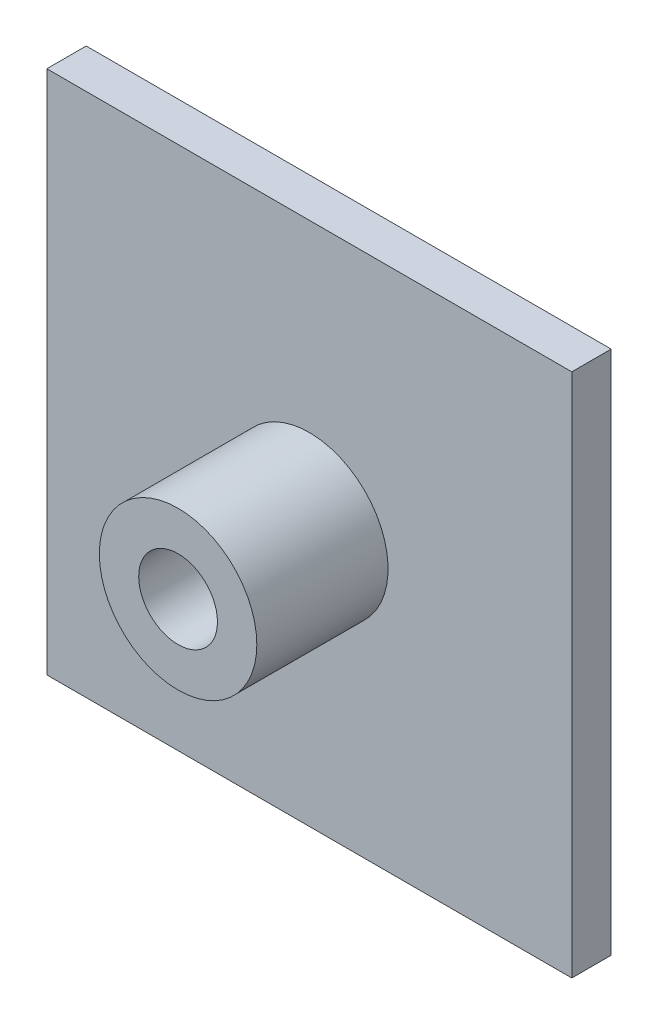
ISO-10303-21;
HEADER;
FILE_DESCRIPTION(('STEP AP214'),'2;1');
FILE_NAME('part.step','',(''),(''),'','','');
FILE_SCHEMA(('AUTOMOTIVE_DESIGN { 1 0 10303 214 1 1 1 1 }'));
ENDSEC;
DATA;
#1=APPLICATION_CONTEXT('core data for automotive mechanical design processes');
#2=APPLICATION_PROTOCOL_DEFINITION('international standard','automotive_design',2000,#1);
#3=PRODUCT_CONTEXT('',#1,'mechanical');
#4=PRODUCT('Part','Part','',(#3));
#5=PRODUCT_RELATED_PRODUCT_CATEGORY('part','',(#4));
#6=PRODUCT_DEFINITION_FORMATION('','',#4);
#7=PRODUCT_DEFINITION_CONTEXT('part definition',#1,'design');
#8=PRODUCT_DEFINITION('design','',#6,#7);
#9=PRODUCT_DEFINITION_SHAPE('','',#8);
#10=(LENGTH_UNIT() NAMED_UNIT(*) SI_UNIT(.MILLI.,.METRE.));
#11=(NAMED_UNIT(*) PLANE_ANGLE_UNIT() SI_UNIT($,.RADIAN.));
#12=(NAMED_UNIT(*) SI_UNIT($,.STERADIAN.) SOLID_ANGLE_UNIT());
#13=UNCERTAINTY_MEASURE_WITH_UNIT(LENGTH_MEASURE(1.E-05),#10,'distance_accuracy_value','');
#14=(GEOMETRIC_REPRESENTATION_CONTEXT(3) GLOBAL_UNCERTAINTY_ASSIGNED_CONTEXT((#13)) GLOBAL_UNIT_ASSIGNED_CONTEXT((#10,
#11,#12)) REPRESENTATION_CONTEXT('',''));
#15=CARTESIAN_POINT('',(0.,0.,0.));
#16=DIRECTION('',(0.,0.,1.));
#17=DIRECTION('',(1.,0.,0.));
#18=AXIS2_PLACEMENT_3D('',#15,#16,#17);
#19=CARTESIAN_POINT('',(0.,0.,1.5));
#20=DIRECTION('',(0.,0.,-1.));
#21=DIRECTION('',(-1.,0.,0.));
#22=AXIS2_PLACEMENT_3D('',#19,#20,#21);
#23=PLANE('',#22);
#24=DIRECTION('',(0.,1.,0.));
#25=VECTOR('',#24,1.);
#26=CARTESIAN_POINT('',(10.,-10.,1.5));
#27=LINE('',#26,#25);
#28=CARTESIAN_POINT('',(10.,-10.,1.5));
#29=VERTEX_POINT('',#28);
#30=CARTESIAN_POINT('',(10.,10.,1.5));
#31=VERTEX_POINT('',#30);
#32=EDGE_CURVE('E88',#29,#31,#27,.T.);
#33=ORIENTED_EDGE('',*,*,#32,.T.);
#34=DIRECTION('',(-1.,0.,0.));
#35=VECTOR('',#34,1.);
#36=CARTESIAN_POINT('',(-10.,10.,1.5));
#37=LINE('',#36,#35);
#38=CARTESIAN_POINT('',(-10.,10.,1.5));
#39=VERTEX_POINT('',#38);
#40=EDGE_CURVE('E83',#31,#39,#37,.T.);
#41=ORIENTED_EDGE('',*,*,#40,.T.);
#42=DIRECTION('',(0.,-1.,0.));
#43=VECTOR('',#42,1.);
#44=CARTESIAN_POINT('',(-10.,-10.,1.5));
#45=LINE('',#44,#43);
#46=CARTESIAN_POINT('',(-10.,-10.,1.5));
#47=VERTEX_POINT('',#46);
#48=EDGE_CURVE('E86',#39,#47,#45,.T.);
#49=ORIENTED_EDGE('',*,*,#48,.T.);
#50=DIRECTION('',(1.,0.,0.));
#51=VECTOR('',#50,1.);
#52=CARTESIAN_POINT('',(-10.,-10.,1.5));
#53=LINE('',#52,#51);
#54=EDGE_CURVE('E52',#47,#29,#53,.T.);
#55=ORIENTED_EDGE('',*,*,#54,.T.);
#56=EDGE_LOOP('',(#33,#41,#49,#55));
#57=FACE_BOUND('',#56,.T.);
#58=CARTESIAN_POINT('',(0.,0.,1.5));
#59=DIRECTION('',(0.,0.,-1.));
#60=DIRECTION('',(-1.,0.,0.));
#61=AXIS2_PLACEMENT_3D('',#58,#59,#60);
#62=CIRCLE('',#61,3.);
#63=CARTESIAN_POINT('',(-3.,0.,1.5));
#64=VERTEX_POINT('',#63);
#65=EDGE_CURVE('E113',#64,#64,#62,.F.);
#66=ORIENTED_EDGE('',*,*,#65,.F.);
#67=EDGE_LOOP('',(#66));
#68=FACE_BOUND('',#67,.T.);
#69=ADVANCED_FACE('F35',(#57,#68),#23,.F.);
#70=CARTESIAN_POINT('',(0.,0.,0.));
#71=DIRECTION('',(0.,0.,-1.));
#72=DIRECTION('',(-1.,0.,0.));
#73=AXIS2_PLACEMENT_3D('',#70,#71,#72);
#74=PLANE('',#73);
#75=CARTESIAN_POINT('',(0.,0.,0.));
#76=DIRECTION('',(0.,0.,-1.));
#77=DIRECTION('',(-1.,0.,0.));
#78=AXIS2_PLACEMENT_3D('',#75,#76,#77);
#79=CIRCLE('',#78,3.);
#80=CARTESIAN_POINT('',(-3.,0.,0.));
#81=VERTEX_POINT('',#80);
#82=EDGE_CURVE('E44',#81,#81,#79,.F.);
#83=ORIENTED_EDGE('',*,*,#82,.T.);
#84=EDGE_LOOP('',(#83));
#85=FACE_BOUND('',#84,.T.);
#86=DIRECTION('',(0.,1.,0.));
#87=VECTOR('',#86,1.);
#88=CARTESIAN_POINT('',(10.,-10.,0.));
#89=LINE('',#88,#87);
#90=CARTESIAN_POINT('',(10.,-10.,0.));
#91=VERTEX_POINT('',#90);
#92=CARTESIAN_POINT('',(10.,10.,0.));
#93=VERTEX_POINT('',#92);
#94=EDGE_CURVE('E103',#91,#93,#89,.T.);
#95=ORIENTED_EDGE('',*,*,#94,.F.);
#96=DIRECTION('',(1.,0.,0.));
#97=VECTOR('',#96,1.);
#98=CARTESIAN_POINT('',(-10.,-10.,0.));
#99=LINE('',#98,#97);
#100=CARTESIAN_POINT('',(-10.,-10.,0.));
#101=VERTEX_POINT('',#100);
#102=EDGE_CURVE('E75',#101,#91,#99,.T.);
#103=ORIENTED_EDGE('',*,*,#102,.F.);
#104=DIRECTION('',(0.,-1.,0.));
#105=VECTOR('',#104,1.);
#106=CARTESIAN_POINT('',(-10.,-10.,0.));
#107=LINE('',#106,#105);
#108=CARTESIAN_POINT('',(-10.,10.,0.));
#109=VERTEX_POINT('',#108);
#110=EDGE_CURVE('E69',#109,#101,#107,.T.);
#111=ORIENTED_EDGE('',*,*,#110,.F.);
#112=DIRECTION('',(-1.,0.,0.));
#113=VECTOR('',#112,1.);
#114=CARTESIAN_POINT('',(-10.,10.,0.));
#115=LINE('',#114,#113);
#116=EDGE_CURVE('E93',#93,#109,#115,.T.);
#117=ORIENTED_EDGE('',*,*,#116,.F.);
#118=EDGE_LOOP('',(#95,#103,#111,#117));
#119=FACE_BOUND('',#118,.T.);
#120=ADVANCED_FACE('F118',(#85,#119),#74,.T.);
#121=CARTESIAN_POINT('',(10.,-10.,1.5));
#122=DIRECTION('',(-1.,0.,0.));
#123=DIRECTION('',(0.,0.,1.));
#124=AXIS2_PLACEMENT_3D('',#121,#122,#123);
#125=PLANE('',#124);
#126=ORIENTED_EDGE('',*,*,#94,.T.);
#127=DIRECTION('',(0.,0.,-1.));
#128=VECTOR('',#127,1.);
#129=CARTESIAN_POINT('',(10.,10.,1.5));
#130=LINE('',#129,#128);
#131=EDGE_CURVE('E94',#31,#93,#130,.T.);
#132=ORIENTED_EDGE('',*,*,#131,.F.);
#133=ORIENTED_EDGE('',*,*,#32,.F.);
#134=DIRECTION('',(0.,0.,-1.));
#135=VECTOR('',#134,1.);
#136=CARTESIAN_POINT('',(10.,-10.,1.5));
#137=LINE('',#136,#135);
#138=EDGE_CURVE('E99',#29,#91,#137,.T.);
#139=ORIENTED_EDGE('',*,*,#138,.T.);
#140=EDGE_LOOP('',(#126,#132,#133,#139));
#141=FACE_BOUND('',#140,.T.);
#142=ADVANCED_FACE('F136',(#141),#125,.F.);
#143=CARTESIAN_POINT('',(-10.,10.,1.5));
#144=DIRECTION('',(0.,-1.,0.));
#145=DIRECTION('',(0.,0.,-1.));
#146=AXIS2_PLACEMENT_3D('',#143,#144,#145);
#147=PLANE('',#146);
#148=ORIENTED_EDGE('',*,*,#116,.T.);
#149=DIRECTION('',(0.,0.,-1.));
#150=VECTOR('',#149,1.);
#151=CARTESIAN_POINT('',(-10.,10.,1.5));
#152=LINE('',#151,#150);
#153=EDGE_CURVE('E91',#39,#109,#152,.T.);
#154=ORIENTED_EDGE('',*,*,#153,.F.);
#155=ORIENTED_EDGE('',*,*,#40,.F.);
#156=ORIENTED_EDGE('',*,*,#131,.T.);
#157=EDGE_LOOP('',(#148,#154,#155,#156));
#158=FACE_BOUND('',#157,.T.);
#159=ADVANCED_FACE('F92',(#158),#147,.F.);
#160=CARTESIAN_POINT('',(-10.,-10.,1.5));
#161=DIRECTION('',(1.,0.,0.));
#162=DIRECTION('',(0.,0.,-1.));
#163=AXIS2_PLACEMENT_3D('',#160,#161,#162);
#164=PLANE('',#163);
#165=ORIENTED_EDGE('',*,*,#110,.T.);
#166=DIRECTION('',(0.,0.,-1.));
#167=VECTOR('',#166,1.);
#168=CARTESIAN_POINT('',(-10.,-10.,1.5));
#169=LINE('',#168,#167);
#170=EDGE_CURVE('E95',#47,#101,#169,.T.);
#171=ORIENTED_EDGE('',*,*,#170,.F.);
#172=ORIENTED_EDGE('',*,*,#48,.F.);
#173=ORIENTED_EDGE('',*,*,#153,.T.);
#174=EDGE_LOOP('',(#165,#171,#172,#173));
#175=FACE_BOUND('',#174,.T.);
#176=ADVANCED_FACE('F97',(#175),#164,.F.);
#177=CARTESIAN_POINT('',(-10.,-10.,1.5));
#178=DIRECTION('',(0.,1.,0.));
#179=DIRECTION('',(0.,0.,1.));
#180=AXIS2_PLACEMENT_3D('',#177,#178,#179);
#181=PLANE('',#180);
#182=ORIENTED_EDGE('',*,*,#102,.T.);
#183=ORIENTED_EDGE('',*,*,#138,.F.);
#184=ORIENTED_EDGE('',*,*,#54,.F.);
#185=ORIENTED_EDGE('',*,*,#170,.T.);
#186=EDGE_LOOP('',(#182,#183,#184,#185));
#187=FACE_BOUND('',#186,.T.);
#188=ADVANCED_FACE('F141',(#187),#181,.F.);
#189=CARTESIAN_POINT('',(0.,0.,1.5));
#190=DIRECTION('',(0.,0.,-1.));
#191=DIRECTION('',(-1.,0.,0.));
#192=AXIS2_PLACEMENT_3D('',#189,#190,#191);
#193=CYLINDRICAL_SURFACE('',#192,1.5);
#194=CARTESIAN_POINT('',(0.,0.,1.5));
#195=DIRECTION('',(0.,0.,-1.));
#196=DIRECTION('',(-1.,0.,0.));
#197=AXIS2_PLACEMENT_3D('',#194,#195,#196);
#198=CIRCLE('',#197,1.5);
#199=CARTESIAN_POINT('',(-1.5,0.,1.5));
#200=VERTEX_POINT('',#199);
#201=EDGE_CURVE('E11',#200,#200,#198,.T.);
#202=ORIENTED_EDGE('',*,*,#201,.T.);
#203=EDGE_LOOP('',(#202));
#204=FACE_BOUND('',#203,.T.);
#205=CARTESIAN_POINT('',(0.,0.,6.5));
#206=DIRECTION('',(0.,0.,1.));
#207=DIRECTION('',(1.,0.,0.));
#208=AXIS2_PLACEMENT_3D('',#205,#206,#207);
#209=CIRCLE('',#208,1.5);
#210=CARTESIAN_POINT('',(1.5,0.,6.5));
#211=VERTEX_POINT('',#210);
#212=EDGE_CURVE('E155',#211,#211,#209,.T.);
#213=ORIENTED_EDGE('',*,*,#212,.T.);
#214=EDGE_LOOP('',(#213));
#215=FACE_BOUND('',#214,.T.);
#216=ADVANCED_FACE('F139',(#204,#215),#193,.F.);
#217=CARTESIAN_POINT('',(0.,0.,6.5));
#218=DIRECTION('',(0.,0.,1.));
#219=DIRECTION('',(1.,0.,0.));
#220=AXIS2_PLACEMENT_3D('',#217,#218,#219);
#221=PLANE('',#220);
#222=CARTESIAN_POINT('',(0.,0.,6.5));
#223=DIRECTION('',(0.,0.,1.));
#224=DIRECTION('',(1.,0.,0.));
#225=AXIS2_PLACEMENT_3D('',#222,#223,#224);
#226=CIRCLE('',#225,3.);
#227=CARTESIAN_POINT('',(3.,0.,6.5));
#228=VERTEX_POINT('',#227);
#229=EDGE_CURVE('E106',#228,#228,#226,.T.);
#230=ORIENTED_EDGE('',*,*,#229,.T.);
#231=EDGE_LOOP('',(#230));
#232=FACE_BOUND('',#231,.T.);
#233=ORIENTED_EDGE('',*,*,#212,.F.);
#234=EDGE_LOOP('',(#233));
#235=FACE_BOUND('',#234,.T.);
#236=ADVANCED_FACE('F127',(#232,#235),#221,.T.);
#237=CARTESIAN_POINT('',(0.,0.,6.5));
#238=DIRECTION('',(0.,0.,-1.));
#239=DIRECTION('',(-1.,0.,0.));
#240=AXIS2_PLACEMENT_3D('',#237,#238,#239);
#241=CYLINDRICAL_SURFACE('',#240,3.);
#242=ORIENTED_EDGE('',*,*,#229,.F.);
#243=EDGE_LOOP('',(#242));
#244=FACE_BOUND('',#243,.T.);
#245=ORIENTED_EDGE('',*,*,#65,.T.);
#246=EDGE_LOOP('',(#245));
#247=FACE_BOUND('',#246,.T.);
#248=ADVANCED_FACE('F122',(#244,#247),#241,.T.);
#249=CARTESIAN_POINT('',(0.,0.,0.));
#250=DIRECTION('',(0.,0.,-1.));
#251=DIRECTION('',(-1.,0.,0.));
#252=AXIS2_PLACEMENT_3D('',#249,#250,#251);
#253=CONICAL_SURFACE('',#252,3.,0.785398163397447);
#254=ORIENTED_EDGE('',*,*,#201,.F.);
#255=EDGE_LOOP('',(#254));
#256=FACE_BOUND('',#255,.T.);
#257=ORIENTED_EDGE('',*,*,#82,.F.);
#258=EDGE_LOOP('',(#257));
#259=FACE_BOUND('',#258,.T.);
#260=ADVANCED_FACE('F37',(#256,#259),#253,.F.);
#261=CLOSED_SHELL('',(#69,#120,#142,#159,#176,#188,#216,#236,#248,#260));
#262=MANIFOLD_SOLID_BREP('B2',#261);
#263=ADVANCED_BREP_SHAPE_REPRESENTATION('',(#18,#262),#14);
#264=SHAPE_DEFINITION_REPRESENTATION(#9,#263);
ENDSEC;
END-ISO-10303-21;
